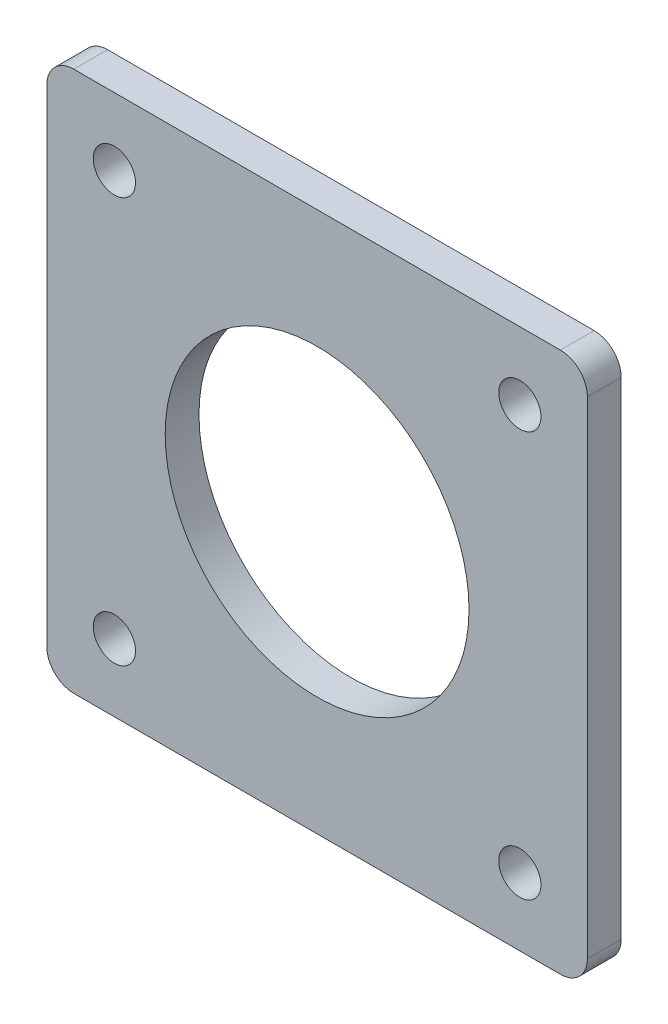
ISO-10303-21;
HEADER;
FILE_DESCRIPTION(('STEP AP214'),'2;1');
FILE_NAME('part.step','',(''),(''),'','','');
FILE_SCHEMA(('AUTOMOTIVE_DESIGN { 1 0 10303 214 1 1 1 1 }'));
ENDSEC;
DATA;
#1=APPLICATION_CONTEXT('core data for automotive mechanical design processes');
#2=APPLICATION_PROTOCOL_DEFINITION('international standard','automotive_design',2000,#1);
#3=PRODUCT_CONTEXT('',#1,'mechanical');
#4=PRODUCT('Part','Part','',(#3));
#5=PRODUCT_RELATED_PRODUCT_CATEGORY('part','',(#4));
#6=PRODUCT_DEFINITION_FORMATION('','',#4);
#7=PRODUCT_DEFINITION_CONTEXT('part definition',#1,'design');
#8=PRODUCT_DEFINITION('design','',#6,#7);
#9=PRODUCT_DEFINITION_SHAPE('','',#8);
#10=(LENGTH_UNIT() NAMED_UNIT(*) SI_UNIT(.MILLI.,.METRE.));
#11=(NAMED_UNIT(*) PLANE_ANGLE_UNIT() SI_UNIT($,.RADIAN.));
#12=(NAMED_UNIT(*) SI_UNIT($,.STERADIAN.) SOLID_ANGLE_UNIT());
#13=UNCERTAINTY_MEASURE_WITH_UNIT(LENGTH_MEASURE(1.E-05),#10,'distance_accuracy_value','');
#14=(GEOMETRIC_REPRESENTATION_CONTEXT(3) GLOBAL_UNCERTAINTY_ASSIGNED_CONTEXT((#13)) GLOBAL_UNIT_ASSIGNED_CONTEXT((#10,
#11,#12)) REPRESENTATION_CONTEXT('',''));
#15=CARTESIAN_POINT('',(0.,0.,0.));
#16=DIRECTION('',(0.,0.,1.));
#17=DIRECTION('',(1.,0.,0.));
#18=AXIS2_PLACEMENT_3D('',#15,#16,#17);
#19=CARTESIAN_POINT('',(0.,0.,3.175));
#20=DIRECTION('',(0.,0.,1.));
#21=DIRECTION('',(1.,0.,0.));
#22=AXIS2_PLACEMENT_3D('',#19,#20,#21);
#23=PLANE('',#22);
#24=CARTESIAN_POINT('',(-19.05,19.05,3.175));
#25=DIRECTION('',(0.,0.,1.));
#26=DIRECTION('',(1.,0.,0.));
#27=AXIS2_PLACEMENT_3D('',#24,#25,#26);
#28=CIRCLE('',#27,1.984375);
#29=CARTESIAN_POINT('',(-17.065625,19.05,3.175));
#30=VERTEX_POINT('',#29);
#31=EDGE_CURVE('E207',#30,#30,#28,.T.);
#32=ORIENTED_EDGE('',*,*,#31,.F.);
#33=EDGE_LOOP('',(#32));
#34=FACE_BOUND('',#33,.T.);
#35=CARTESIAN_POINT('',(19.05,19.05,3.175));
#36=DIRECTION('',(0.,0.,1.));
#37=DIRECTION('',(1.,0.,0.));
#38=AXIS2_PLACEMENT_3D('',#35,#36,#37);
#39=CIRCLE('',#38,1.984375);
#40=CARTESIAN_POINT('',(21.034375,19.05,3.175));
#41=VERTEX_POINT('',#40);
#42=EDGE_CURVE('E201',#41,#41,#39,.T.);
#43=ORIENTED_EDGE('',*,*,#42,.F.);
#44=EDGE_LOOP('',(#43));
#45=FACE_BOUND('',#44,.T.);
#46=CARTESIAN_POINT('',(19.05,-19.05,3.175));
#47=DIRECTION('',(0.,0.,1.));
#48=DIRECTION('',(1.,0.,0.));
#49=AXIS2_PLACEMENT_3D('',#46,#47,#48);
#50=CIRCLE('',#49,1.984375);
#51=CARTESIAN_POINT('',(21.034375,-19.05,3.175));
#52=VERTEX_POINT('',#51);
#53=EDGE_CURVE('E195',#52,#52,#50,.T.);
#54=ORIENTED_EDGE('',*,*,#53,.F.);
#55=EDGE_LOOP('',(#54));
#56=FACE_BOUND('',#55,.T.);
#57=CARTESIAN_POINT('',(-19.05,-19.05,3.175));
#58=DIRECTION('',(0.,0.,1.));
#59=DIRECTION('',(1.,0.,0.));
#60=AXIS2_PLACEMENT_3D('',#57,#58,#59);
#61=CIRCLE('',#60,1.984375);
#62=CARTESIAN_POINT('',(-17.065625,-19.05,3.175));
#63=VERTEX_POINT('',#62);
#64=EDGE_CURVE('E189',#63,#63,#61,.T.);
#65=ORIENTED_EDGE('',*,*,#64,.F.);
#66=EDGE_LOOP('',(#65));
#67=FACE_BOUND('',#66,.T.);
#68=DIRECTION('',(1.,0.,0.));
#69=VECTOR('',#68,1.);
#70=CARTESIAN_POINT('',(25.4,-25.4,3.175));
#71=LINE('',#70,#69);
#72=CARTESIAN_POINT('',(-22.86,-25.4,3.175));
#73=VERTEX_POINT('',#72);
#74=CARTESIAN_POINT('',(22.86,-25.4,3.175));
#75=VERTEX_POINT('',#74);
#76=EDGE_CURVE('E170',#73,#75,#71,.T.);
#77=ORIENTED_EDGE('',*,*,#76,.T.);
#78=CARTESIAN_POINT('',(22.86,-22.86,3.175));
#79=DIRECTION('',(0.,0.,1.));
#80=DIRECTION('',(1.,0.,0.));
#81=AXIS2_PLACEMENT_3D('',#78,#79,#80);
#82=CIRCLE('',#81,2.54);
#83=CARTESIAN_POINT('',(25.4,-22.86,3.175));
#84=VERTEX_POINT('',#83);
#85=EDGE_CURVE('E150',#75,#84,#82,.T.);
#86=ORIENTED_EDGE('',*,*,#85,.T.);
#87=DIRECTION('',(0.,1.,0.));
#88=VECTOR('',#87,1.);
#89=CARTESIAN_POINT('',(25.4,-25.4,3.175));
#90=LINE('',#89,#88);
#91=CARTESIAN_POINT('',(25.4,22.86,3.175));
#92=VERTEX_POINT('',#91);
#93=EDGE_CURVE('E120',#84,#92,#90,.T.);
#94=ORIENTED_EDGE('',*,*,#93,.T.);
#95=CARTESIAN_POINT('',(22.86,22.86,3.175));
#96=DIRECTION('',(0.,0.,1.));
#97=DIRECTION('',(1.,0.,0.));
#98=AXIS2_PLACEMENT_3D('',#95,#96,#97);
#99=CIRCLE('',#98,2.54);
#100=CARTESIAN_POINT('',(22.86,25.4,3.175));
#101=VERTEX_POINT('',#100);
#102=EDGE_CURVE('E56',#92,#101,#99,.T.);
#103=ORIENTED_EDGE('',*,*,#102,.T.);
#104=DIRECTION('',(-1.,0.,0.));
#105=VECTOR('',#104,1.);
#106=CARTESIAN_POINT('',(25.4,25.4,3.175));
#107=LINE('',#106,#105);
#108=CARTESIAN_POINT('',(-22.86,25.4,3.175));
#109=VERTEX_POINT('',#108);
#110=EDGE_CURVE('E137',#101,#109,#107,.T.);
#111=ORIENTED_EDGE('',*,*,#110,.T.);
#112=CARTESIAN_POINT('',(-22.86,22.86,3.175));
#113=DIRECTION('',(0.,0.,1.));
#114=DIRECTION('',(1.,0.,0.));
#115=AXIS2_PLACEMENT_3D('',#112,#113,#114);
#116=CIRCLE('',#115,2.54);
#117=CARTESIAN_POINT('',(-25.4,22.86,3.175));
#118=VERTEX_POINT('',#117);
#119=EDGE_CURVE('E145',#109,#118,#116,.T.);
#120=ORIENTED_EDGE('',*,*,#119,.T.);
#121=DIRECTION('',(0.,-1.,0.));
#122=VECTOR('',#121,1.);
#123=CARTESIAN_POINT('',(-25.4,-25.4,3.175));
#124=LINE('',#123,#122);
#125=CARTESIAN_POINT('',(-25.4,-22.86,3.175));
#126=VERTEX_POINT('',#125);
#127=EDGE_CURVE('E131',#118,#126,#124,.T.);
#128=ORIENTED_EDGE('',*,*,#127,.T.);
#129=CARTESIAN_POINT('',(-22.86,-22.86,3.175));
#130=DIRECTION('',(0.,0.,1.));
#131=DIRECTION('',(1.,0.,0.));
#132=AXIS2_PLACEMENT_3D('',#129,#130,#131);
#133=CIRCLE('',#132,2.54);
#134=EDGE_CURVE('E148',#126,#73,#133,.T.);
#135=ORIENTED_EDGE('',*,*,#134,.T.);
#136=EDGE_LOOP('',(#77,#86,#94,#103,#111,#120,#128,#135));
#137=FACE_BOUND('',#136,.T.);
#138=CARTESIAN_POINT('',(0.,0.,3.175));
#139=DIRECTION('',(0.,0.,1.));
#140=DIRECTION('',(1.,0.,0.));
#141=AXIS2_PLACEMENT_3D('',#138,#139,#140);
#142=CIRCLE('',#141,14.2748);
#143=CARTESIAN_POINT('',(14.2748,0.,3.175));
#144=VERTEX_POINT('',#143);
#145=EDGE_CURVE('E176',#144,#144,#142,.T.);
#146=ORIENTED_EDGE('',*,*,#145,.F.);
#147=EDGE_LOOP('',(#146));
#148=FACE_BOUND('',#147,.T.);
#149=ADVANCED_FACE('F35',(#34,#45,#56,#67,#137,#148),#23,.T.);
#150=CARTESIAN_POINT('',(0.,0.,0.));
#151=DIRECTION('',(0.,0.,1.));
#152=DIRECTION('',(1.,0.,0.));
#153=AXIS2_PLACEMENT_3D('',#150,#151,#152);
#154=PLANE('',#153);
#155=CARTESIAN_POINT('',(-19.05,19.05,0.));
#156=DIRECTION('',(0.,0.,1.));
#157=DIRECTION('',(1.,0.,0.));
#158=AXIS2_PLACEMENT_3D('',#155,#156,#157);
#159=CIRCLE('',#158,1.984375);
#160=CARTESIAN_POINT('',(-17.065625,19.05,0.));
#161=VERTEX_POINT('',#160);
#162=EDGE_CURVE('E204',#161,#161,#159,.T.);
#163=ORIENTED_EDGE('',*,*,#162,.T.);
#164=EDGE_LOOP('',(#163));
#165=FACE_BOUND('',#164,.T.);
#166=CARTESIAN_POINT('',(19.05,19.05,0.));
#167=DIRECTION('',(0.,0.,1.));
#168=DIRECTION('',(1.,0.,0.));
#169=AXIS2_PLACEMENT_3D('',#166,#167,#168);
#170=CIRCLE('',#169,1.984375);
#171=CARTESIAN_POINT('',(21.034375,19.05,0.));
#172=VERTEX_POINT('',#171);
#173=EDGE_CURVE('E198',#172,#172,#170,.T.);
#174=ORIENTED_EDGE('',*,*,#173,.T.);
#175=EDGE_LOOP('',(#174));
#176=FACE_BOUND('',#175,.T.);
#177=CARTESIAN_POINT('',(19.05,-19.05,0.));
#178=DIRECTION('',(0.,0.,1.));
#179=DIRECTION('',(1.,0.,0.));
#180=AXIS2_PLACEMENT_3D('',#177,#178,#179);
#181=CIRCLE('',#180,1.984375);
#182=CARTESIAN_POINT('',(21.034375,-19.05,0.));
#183=VERTEX_POINT('',#182);
#184=EDGE_CURVE('E192',#183,#183,#181,.T.);
#185=ORIENTED_EDGE('',*,*,#184,.T.);
#186=EDGE_LOOP('',(#185));
#187=FACE_BOUND('',#186,.T.);
#188=CARTESIAN_POINT('',(-19.05,-19.05,0.));
#189=DIRECTION('',(0.,0.,1.));
#190=DIRECTION('',(1.,0.,0.));
#191=AXIS2_PLACEMENT_3D('',#188,#189,#190);
#192=CIRCLE('',#191,1.984375);
#193=CARTESIAN_POINT('',(-17.065625,-19.05,0.));
#194=VERTEX_POINT('',#193);
#195=EDGE_CURVE('E185',#194,#194,#192,.T.);
#196=ORIENTED_EDGE('',*,*,#195,.T.);
#197=EDGE_LOOP('',(#196));
#198=FACE_BOUND('',#197,.T.);
#199=DIRECTION('',(0.,1.,0.));
#200=VECTOR('',#199,1.);
#201=CARTESIAN_POINT('',(25.4,-25.4,0.));
#202=LINE('',#201,#200);
#203=CARTESIAN_POINT('',(25.4,-22.86,0.));
#204=VERTEX_POINT('',#203);
#205=CARTESIAN_POINT('',(25.4,22.86,0.));
#206=VERTEX_POINT('',#205);
#207=EDGE_CURVE('E118',#204,#206,#202,.T.);
#208=ORIENTED_EDGE('',*,*,#207,.F.);
#209=CARTESIAN_POINT('',(22.86,-22.86,0.));
#210=DIRECTION('',(0.,0.,1.));
#211=DIRECTION('',(1.,0.,0.));
#212=AXIS2_PLACEMENT_3D('',#209,#210,#211);
#213=CIRCLE('',#212,2.54);
#214=CARTESIAN_POINT('',(22.86,-25.4,0.));
#215=VERTEX_POINT('',#214);
#216=EDGE_CURVE('E101',#204,#215,#213,.F.);
#217=ORIENTED_EDGE('',*,*,#216,.T.);
#218=DIRECTION('',(1.,0.,0.));
#219=VECTOR('',#218,1.);
#220=CARTESIAN_POINT('',(25.4,-25.4,0.));
#221=LINE('',#220,#219);
#222=CARTESIAN_POINT('',(-22.86,-25.4,0.));
#223=VERTEX_POINT('',#222);
#224=EDGE_CURVE('E129',#223,#215,#221,.T.);
#225=ORIENTED_EDGE('',*,*,#224,.F.);
#226=CARTESIAN_POINT('',(-22.86,-22.86,0.));
#227=DIRECTION('',(0.,0.,1.));
#228=DIRECTION('',(1.,0.,0.));
#229=AXIS2_PLACEMENT_3D('',#226,#227,#228);
#230=CIRCLE('',#229,2.54);
#231=CARTESIAN_POINT('',(-25.4,-22.86,0.));
#232=VERTEX_POINT('',#231);
#233=EDGE_CURVE('E112',#223,#232,#230,.F.);
#234=ORIENTED_EDGE('',*,*,#233,.T.);
#235=DIRECTION('',(0.,-1.,0.));
#236=VECTOR('',#235,1.);
#237=CARTESIAN_POINT('',(-25.4,-25.4,0.));
#238=LINE('',#237,#236);
#239=CARTESIAN_POINT('',(-25.4,22.86,0.));
#240=VERTEX_POINT('',#239);
#241=EDGE_CURVE('E133',#240,#232,#238,.T.);
#242=ORIENTED_EDGE('',*,*,#241,.F.);
#243=CARTESIAN_POINT('',(-22.86,22.86,0.));
#244=DIRECTION('',(0.,0.,1.));
#245=DIRECTION('',(1.,0.,0.));
#246=AXIS2_PLACEMENT_3D('',#243,#244,#245);
#247=CIRCLE('',#246,2.54);
#248=CARTESIAN_POINT('',(-22.86,25.4,0.));
#249=VERTEX_POINT('',#248);
#250=EDGE_CURVE('E121',#240,#249,#247,.F.);
#251=ORIENTED_EDGE('',*,*,#250,.T.);
#252=DIRECTION('',(-1.,0.,0.));
#253=VECTOR('',#252,1.);
#254=CARTESIAN_POINT('',(25.4,25.4,0.));
#255=LINE('',#254,#253);
#256=CARTESIAN_POINT('',(22.86,25.4,0.));
#257=VERTEX_POINT('',#256);
#258=EDGE_CURVE('E128',#257,#249,#255,.T.);
#259=ORIENTED_EDGE('',*,*,#258,.F.);
#260=CARTESIAN_POINT('',(22.86,22.86,0.));
#261=DIRECTION('',(0.,0.,1.));
#262=DIRECTION('',(1.,0.,0.));
#263=AXIS2_PLACEMENT_3D('',#260,#261,#262);
#264=CIRCLE('',#263,2.54);
#265=EDGE_CURVE('E127',#257,#206,#264,.F.);
#266=ORIENTED_EDGE('',*,*,#265,.T.);
#267=EDGE_LOOP('',(#208,#217,#225,#234,#242,#251,#259,#266));
#268=FACE_BOUND('',#267,.T.);
#269=CARTESIAN_POINT('',(0.,0.,0.));
#270=DIRECTION('',(0.,0.,1.));
#271=DIRECTION('',(1.,0.,0.));
#272=AXIS2_PLACEMENT_3D('',#269,#270,#271);
#273=CIRCLE('',#272,14.2748);
#274=CARTESIAN_POINT('',(14.2748,0.,0.));
#275=VERTEX_POINT('',#274);
#276=EDGE_CURVE('E178',#275,#275,#273,.T.);
#277=ORIENTED_EDGE('',*,*,#276,.T.);
#278=EDGE_LOOP('',(#277));
#279=FACE_BOUND('',#278,.T.);
#280=ADVANCED_FACE('F124',(#165,#176,#187,#198,#268,#279),#154,.F.);
#281=CARTESIAN_POINT('',(-25.4,-25.4,3.175));
#282=DIRECTION('',(1.,0.,0.));
#283=DIRECTION('',(0.,0.,-1.));
#284=AXIS2_PLACEMENT_3D('',#281,#282,#283);
#285=PLANE('',#284);
#286=ORIENTED_EDGE('',*,*,#241,.T.);
#287=DIRECTION('',(0.,0.,-1.));
#288=VECTOR('',#287,1.);
#289=CARTESIAN_POINT('',(-25.4,-22.86,3.175));
#290=LINE('',#289,#288);
#291=EDGE_CURVE('E155',#232,#126,#290,.F.);
#292=ORIENTED_EDGE('',*,*,#291,.T.);
#293=ORIENTED_EDGE('',*,*,#127,.F.);
#294=DIRECTION('',(0.,0.,-1.));
#295=VECTOR('',#294,1.);
#296=CARTESIAN_POINT('',(-25.4,22.86,3.175));
#297=LINE('',#296,#295);
#298=EDGE_CURVE('E152',#118,#240,#297,.T.);
#299=ORIENTED_EDGE('',*,*,#298,.T.);
#300=EDGE_LOOP('',(#286,#292,#293,#299));
#301=FACE_BOUND('',#300,.T.);
#302=ADVANCED_FACE('F161',(#301),#285,.F.);
#303=CARTESIAN_POINT('',(25.4,-25.4,3.175));
#304=DIRECTION('',(0.,1.,0.));
#305=DIRECTION('',(-1.,0.,0.));
#306=AXIS2_PLACEMENT_3D('',#303,#304,#305);
#307=PLANE('',#306);
#308=ORIENTED_EDGE('',*,*,#224,.T.);
#309=DIRECTION('',(0.,0.,-1.));
#310=VECTOR('',#309,1.);
#311=CARTESIAN_POINT('',(22.86,-25.4,3.175));
#312=LINE('',#311,#310);
#313=EDGE_CURVE('E106',#215,#75,#312,.F.);
#314=ORIENTED_EDGE('',*,*,#313,.T.);
#315=ORIENTED_EDGE('',*,*,#76,.F.);
#316=DIRECTION('',(0.,0.,-1.));
#317=VECTOR('',#316,1.);
#318=CARTESIAN_POINT('',(-22.86,-25.4,3.175));
#319=LINE('',#318,#317);
#320=EDGE_CURVE('E111',#73,#223,#319,.T.);
#321=ORIENTED_EDGE('',*,*,#320,.T.);
#322=EDGE_LOOP('',(#308,#314,#315,#321));
#323=FACE_BOUND('',#322,.T.);
#324=ADVANCED_FACE('F175',(#323),#307,.F.);
#325=CARTESIAN_POINT('',(25.4,-25.4,3.175));
#326=DIRECTION('',(-1.,0.,0.));
#327=DIRECTION('',(0.,0.,1.));
#328=AXIS2_PLACEMENT_3D('',#325,#326,#327);
#329=PLANE('',#328);
#330=ORIENTED_EDGE('',*,*,#93,.F.);
#331=DIRECTION('',(0.,0.,-1.));
#332=VECTOR('',#331,1.);
#333=CARTESIAN_POINT('',(25.4,-22.86,3.175));
#334=LINE('',#333,#332);
#335=EDGE_CURVE('E105',#84,#204,#334,.T.);
#336=ORIENTED_EDGE('',*,*,#335,.T.);
#337=ORIENTED_EDGE('',*,*,#207,.T.);
#338=DIRECTION('',(0.,0.,-1.));
#339=VECTOR('',#338,1.);
#340=CARTESIAN_POINT('',(25.4,22.86,3.175));
#341=LINE('',#340,#339);
#342=EDGE_CURVE('E122',#206,#92,#341,.F.);
#343=ORIENTED_EDGE('',*,*,#342,.T.);
#344=EDGE_LOOP('',(#330,#336,#337,#343));
#345=FACE_BOUND('',#344,.T.);
#346=ADVANCED_FACE('F117',(#345),#329,.F.);
#347=CARTESIAN_POINT('',(25.4,25.4,3.175));
#348=DIRECTION('',(0.,-1.,0.));
#349=DIRECTION('',(1.,0.,0.));
#350=AXIS2_PLACEMENT_3D('',#347,#348,#349);
#351=PLANE('',#350);
#352=ORIENTED_EDGE('',*,*,#110,.F.);
#353=DIRECTION('',(0.,0.,-1.));
#354=VECTOR('',#353,1.);
#355=CARTESIAN_POINT('',(22.86,25.4,3.175));
#356=LINE('',#355,#354);
#357=EDGE_CURVE('E11',#101,#257,#356,.T.);
#358=ORIENTED_EDGE('',*,*,#357,.T.);
#359=ORIENTED_EDGE('',*,*,#258,.T.);
#360=DIRECTION('',(0.,0.,-1.));
#361=VECTOR('',#360,1.);
#362=CARTESIAN_POINT('',(-22.86,25.4,3.175));
#363=LINE('',#362,#361);
#364=EDGE_CURVE('E43',#249,#109,#363,.F.);
#365=ORIENTED_EDGE('',*,*,#364,.T.);
#366=EDGE_LOOP('',(#352,#358,#359,#365));
#367=FACE_BOUND('',#366,.T.);
#368=ADVANCED_FACE('F241',(#367),#351,.F.);
#369=CARTESIAN_POINT('',(0.,0.,3.175));
#370=DIRECTION('',(0.,0.,-1.));
#371=DIRECTION('',(-1.,0.,0.));
#372=AXIS2_PLACEMENT_3D('',#369,#370,#371);
#373=CYLINDRICAL_SURFACE('',#372,14.2748);
#374=ORIENTED_EDGE('',*,*,#145,.T.);
#375=EDGE_LOOP('',(#374));
#376=FACE_BOUND('',#375,.T.);
#377=ORIENTED_EDGE('',*,*,#276,.F.);
#378=EDGE_LOOP('',(#377));
#379=FACE_BOUND('',#378,.T.);
#380=ADVANCED_FACE('F239',(#376,#379),#373,.F.);
#381=CARTESIAN_POINT('',(22.86,-22.86,3.175));
#382=DIRECTION('',(0.,0.,-1.));
#383=DIRECTION('',(-1.,0.,0.));
#384=AXIS2_PLACEMENT_3D('',#381,#382,#383);
#385=CYLINDRICAL_SURFACE('',#384,2.54);
#386=ORIENTED_EDGE('',*,*,#85,.F.);
#387=ORIENTED_EDGE('',*,*,#313,.F.);
#388=ORIENTED_EDGE('',*,*,#216,.F.);
#389=ORIENTED_EDGE('',*,*,#335,.F.);
#390=EDGE_LOOP('',(#386,#387,#388,#389));
#391=FACE_BOUND('',#390,.T.);
#392=ADVANCED_FACE('F104',(#391),#385,.T.);
#393=CARTESIAN_POINT('',(-22.86,-22.86,3.175));
#394=DIRECTION('',(0.,0.,-1.));
#395=DIRECTION('',(-1.,0.,0.));
#396=AXIS2_PLACEMENT_3D('',#393,#394,#395);
#397=CYLINDRICAL_SURFACE('',#396,2.54);
#398=ORIENTED_EDGE('',*,*,#134,.F.);
#399=ORIENTED_EDGE('',*,*,#291,.F.);
#400=ORIENTED_EDGE('',*,*,#233,.F.);
#401=ORIENTED_EDGE('',*,*,#320,.F.);
#402=EDGE_LOOP('',(#398,#399,#400,#401));
#403=FACE_BOUND('',#402,.T.);
#404=ADVANCED_FACE('F173',(#403),#397,.T.);
#405=CARTESIAN_POINT('',(22.86,22.86,3.175));
#406=DIRECTION('',(0.,0.,-1.));
#407=DIRECTION('',(-1.,0.,0.));
#408=AXIS2_PLACEMENT_3D('',#405,#406,#407);
#409=CYLINDRICAL_SURFACE('',#408,2.54);
#410=ORIENTED_EDGE('',*,*,#102,.F.);
#411=ORIENTED_EDGE('',*,*,#342,.F.);
#412=ORIENTED_EDGE('',*,*,#265,.F.);
#413=ORIENTED_EDGE('',*,*,#357,.F.);
#414=EDGE_LOOP('',(#410,#411,#412,#413));
#415=FACE_BOUND('',#414,.T.);
#416=ADVANCED_FACE('F234',(#415),#409,.T.);
#417=CARTESIAN_POINT('',(-22.86,22.86,3.175));
#418=DIRECTION('',(0.,0.,-1.));
#419=DIRECTION('',(-1.,0.,0.));
#420=AXIS2_PLACEMENT_3D('',#417,#418,#419);
#421=CYLINDRICAL_SURFACE('',#420,2.54);
#422=ORIENTED_EDGE('',*,*,#119,.F.);
#423=ORIENTED_EDGE('',*,*,#364,.F.);
#424=ORIENTED_EDGE('',*,*,#250,.F.);
#425=ORIENTED_EDGE('',*,*,#298,.F.);
#426=EDGE_LOOP('',(#422,#423,#424,#425));
#427=FACE_BOUND('',#426,.T.);
#428=ADVANCED_FACE('F37',(#427),#421,.T.);
#429=CARTESIAN_POINT('',(-19.05,-19.05,3.175));
#430=DIRECTION('',(0.,0.,1.));
#431=DIRECTION('',(1.,0.,0.));
#432=AXIS2_PLACEMENT_3D('',#429,#430,#431);
#433=CYLINDRICAL_SURFACE('',#432,1.984375);
#434=ORIENTED_EDGE('',*,*,#195,.F.);
#435=EDGE_LOOP('',(#434));
#436=FACE_BOUND('',#435,.T.);
#437=ORIENTED_EDGE('',*,*,#64,.T.);
#438=EDGE_LOOP('',(#437));
#439=FACE_BOUND('',#438,.T.);
#440=ADVANCED_FACE('F222',(#436,#439),#433,.F.);
#441=CARTESIAN_POINT('',(19.05,-19.05,3.175));
#442=DIRECTION('',(0.,0.,1.));
#443=DIRECTION('',(1.,0.,0.));
#444=AXIS2_PLACEMENT_3D('',#441,#442,#443);
#445=CYLINDRICAL_SURFACE('',#444,1.984375);
#446=ORIENTED_EDGE('',*,*,#184,.F.);
#447=EDGE_LOOP('',(#446));
#448=FACE_BOUND('',#447,.T.);
#449=ORIENTED_EDGE('',*,*,#53,.T.);
#450=EDGE_LOOP('',(#449));
#451=FACE_BOUND('',#450,.T.);
#452=ADVANCED_FACE('F224',(#448,#451),#445,.F.);
#453=CARTESIAN_POINT('',(19.05,19.05,3.175));
#454=DIRECTION('',(0.,0.,1.));
#455=DIRECTION('',(1.,0.,0.));
#456=AXIS2_PLACEMENT_3D('',#453,#454,#455);
#457=CYLINDRICAL_SURFACE('',#456,1.984375);
#458=ORIENTED_EDGE('',*,*,#173,.F.);
#459=EDGE_LOOP('',(#458));
#460=FACE_BOUND('',#459,.T.);
#461=ORIENTED_EDGE('',*,*,#42,.T.);
#462=EDGE_LOOP('',(#461));
#463=FACE_BOUND('',#462,.T.);
#464=ADVANCED_FACE('F231',(#460,#463),#457,.F.);
#465=CARTESIAN_POINT('',(-19.05,19.05,3.175));
#466=DIRECTION('',(0.,0.,1.));
#467=DIRECTION('',(1.,0.,0.));
#468=AXIS2_PLACEMENT_3D('',#465,#466,#467);
#469=CYLINDRICAL_SURFACE('',#468,1.984375);
#470=ORIENTED_EDGE('',*,*,#162,.F.);
#471=EDGE_LOOP('',(#470));
#472=FACE_BOUND('',#471,.T.);
#473=ORIENTED_EDGE('',*,*,#31,.T.);
#474=EDGE_LOOP('',(#473));
#475=FACE_BOUND('',#474,.T.);
#476=ADVANCED_FACE('F211',(#472,#475),#469,.F.);
#477=CLOSED_SHELL('',(#149,#280,#302,#324,#346,#368,#380,#392,#404,#416,#428,#440,#452,#464,#476));
#478=MANIFOLD_SOLID_BREP('B2',#477);
#479=ADVANCED_BREP_SHAPE_REPRESENTATION('',(#18,#478),#14);
#480=SHAPE_DEFINITION_REPRESENTATION(#9,#479);
ENDSEC;
END-ISO-10303-21;
